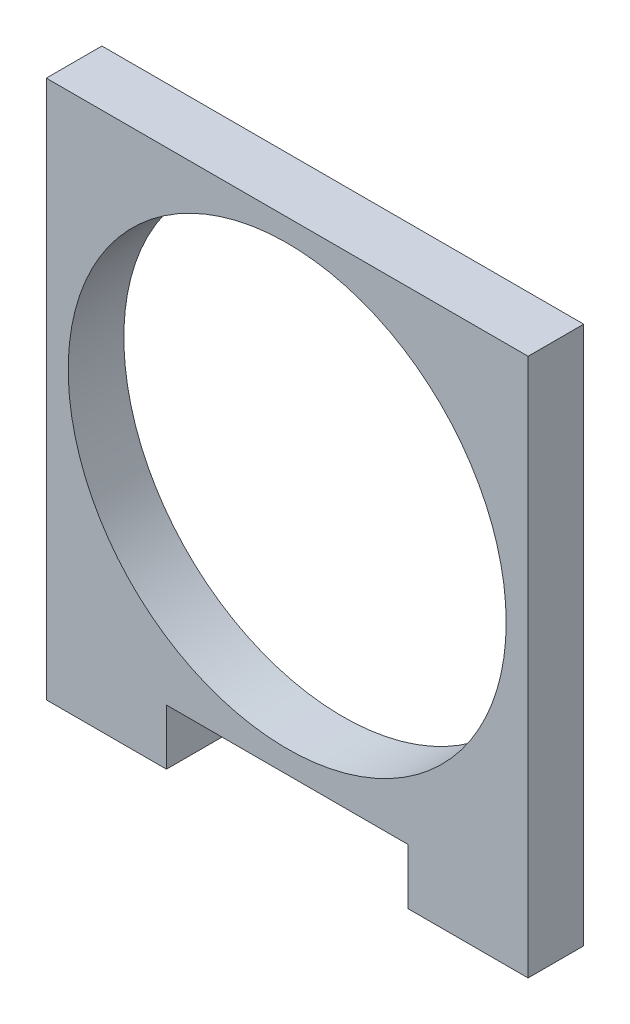
ISO-10303-21;
HEADER;
FILE_DESCRIPTION(('STEP AP214'),'2;1');
FILE_NAME('part.step','',(''),(''),'','','');
FILE_SCHEMA(('AUTOMOTIVE_DESIGN { 1 0 10303 214 1 1 1 1 }'));
ENDSEC;
DATA;
#1=APPLICATION_CONTEXT('core data for automotive mechanical design processes');
#2=APPLICATION_PROTOCOL_DEFINITION('international standard','automotive_design',2000,#1);
#3=PRODUCT_CONTEXT('',#1,'mechanical');
#4=PRODUCT('Part','Part','',(#3));
#5=PRODUCT_RELATED_PRODUCT_CATEGORY('part','',(#4));
#6=PRODUCT_DEFINITION_FORMATION('','',#4);
#7=PRODUCT_DEFINITION_CONTEXT('part definition',#1,'design');
#8=PRODUCT_DEFINITION('design','',#6,#7);
#9=PRODUCT_DEFINITION_SHAPE('','',#8);
#10=(LENGTH_UNIT() NAMED_UNIT(*) SI_UNIT(.MILLI.,.METRE.));
#11=(NAMED_UNIT(*) PLANE_ANGLE_UNIT() SI_UNIT($,.RADIAN.));
#12=(NAMED_UNIT(*) SI_UNIT($,.STERADIAN.) SOLID_ANGLE_UNIT());
#13=UNCERTAINTY_MEASURE_WITH_UNIT(LENGTH_MEASURE(1.E-05),#10,'distance_accuracy_value','');
#14=(GEOMETRIC_REPRESENTATION_CONTEXT(3) GLOBAL_UNCERTAINTY_ASSIGNED_CONTEXT((#13)) GLOBAL_UNIT_ASSIGNED_CONTEXT((#10,
#11,#12)) REPRESENTATION_CONTEXT('',''));
#15=CARTESIAN_POINT('',(0.,0.,0.));
#16=DIRECTION('',(0.,0.,1.));
#17=DIRECTION('',(1.,0.,0.));
#18=AXIS2_PLACEMENT_3D('',#15,#16,#17);
#19=CARTESIAN_POINT('',(0.,-6.35,6.35));
#20=DIRECTION('',(0.,1.,0.));
#21=DIRECTION('',(0.,0.,1.));
#22=AXIS2_PLACEMENT_3D('',#19,#20,#21);
#23=PLANE('',#22);
#24=DIRECTION('',(1.,0.,0.));
#25=VECTOR('',#24,1.);
#26=CARTESIAN_POINT('',(0.,-6.35,0.));
#27=LINE('',#26,#25);
#28=CARTESIAN_POINT('',(0.,-6.35,0.));
#29=VERTEX_POINT('',#28);
#30=CARTESIAN_POINT('',(13.716,-6.35,0.));
#31=VERTEX_POINT('',#30);
#32=EDGE_CURVE('E132',#29,#31,#27,.T.);
#33=ORIENTED_EDGE('',*,*,#32,.T.);
#34=DIRECTION('',(0.,0.,-1.));
#35=VECTOR('',#34,1.);
#36=CARTESIAN_POINT('',(13.716,-6.35,6.35));
#37=LINE('',#36,#35);
#38=CARTESIAN_POINT('',(13.716,-6.35,6.35));
#39=VERTEX_POINT('',#38);
#40=EDGE_CURVE('E40',#39,#31,#37,.T.);
#41=ORIENTED_EDGE('',*,*,#40,.F.);
#42=DIRECTION('',(1.,0.,0.));
#43=VECTOR('',#42,1.);
#44=CARTESIAN_POINT('',(0.,-6.35,6.35));
#45=LINE('',#44,#43);
#46=CARTESIAN_POINT('',(0.,-6.35,6.35));
#47=VERTEX_POINT('',#46);
#48=EDGE_CURVE('E91',#47,#39,#45,.T.);
#49=ORIENTED_EDGE('',*,*,#48,.F.);
#50=DIRECTION('',(0.,0.,-1.));
#51=VECTOR('',#50,1.);
#52=CARTESIAN_POINT('',(0.,-6.35,6.35));
#53=LINE('',#52,#51);
#54=EDGE_CURVE('E11',#47,#29,#53,.T.);
#55=ORIENTED_EDGE('',*,*,#54,.T.);
#56=EDGE_LOOP('',(#33,#41,#49,#55));
#57=FACE_BOUND('',#56,.T.);
#58=ADVANCED_FACE('F32',(#57),#23,.F.);
#59=CARTESIAN_POINT('',(13.716,0.,6.35));
#60=DIRECTION('',(-1.,0.,0.));
#61=DIRECTION('',(0.,-1.,0.));
#62=AXIS2_PLACEMENT_3D('',#59,#60,#61);
#63=PLANE('',#62);
#64=DIRECTION('',(0.,1.,0.));
#65=VECTOR('',#64,1.);
#66=CARTESIAN_POINT('',(13.716,0.,0.));
#67=LINE('',#66,#65);
#68=CARTESIAN_POINT('',(13.716,0.,0.));
#69=VERTEX_POINT('',#68);
#70=EDGE_CURVE('E134',#31,#69,#67,.T.);
#71=ORIENTED_EDGE('',*,*,#70,.T.);
#72=DIRECTION('',(0.,0.,-1.));
#73=VECTOR('',#72,1.);
#74=CARTESIAN_POINT('',(13.716,0.,6.35));
#75=LINE('',#74,#73);
#76=CARTESIAN_POINT('',(13.716,0.,6.35));
#77=VERTEX_POINT('',#76);
#78=EDGE_CURVE('E152',#77,#69,#75,.T.);
#79=ORIENTED_EDGE('',*,*,#78,.F.);
#80=DIRECTION('',(0.,1.,0.));
#81=VECTOR('',#80,1.);
#82=CARTESIAN_POINT('',(13.716,0.,6.35));
#83=LINE('',#82,#81);
#84=EDGE_CURVE('E160',#39,#77,#83,.T.);
#85=ORIENTED_EDGE('',*,*,#84,.F.);
#86=ORIENTED_EDGE('',*,*,#40,.T.);
#87=EDGE_LOOP('',(#71,#79,#85,#86));
#88=FACE_BOUND('',#87,.T.);
#89=ADVANCED_FACE('F158',(#88),#63,.F.);
#90=CARTESIAN_POINT('',(13.716,0.,6.35));
#91=DIRECTION('',(0.,1.,0.));
#92=DIRECTION('',(-1.,0.,0.));
#93=AXIS2_PLACEMENT_3D('',#90,#91,#92);
#94=PLANE('',#93);
#95=DIRECTION('',(1.,0.,0.));
#96=VECTOR('',#95,1.);
#97=CARTESIAN_POINT('',(13.716,0.,0.));
#98=LINE('',#97,#96);
#99=CARTESIAN_POINT('',(41.283999982,0.,0.));
#100=VERTEX_POINT('',#99);
#101=EDGE_CURVE('E137',#69,#100,#98,.T.);
#102=ORIENTED_EDGE('',*,*,#101,.T.);
#103=DIRECTION('',(0.,0.,-1.));
#104=VECTOR('',#103,1.);
#105=CARTESIAN_POINT('',(41.283999982,0.,6.35));
#106=LINE('',#105,#104);
#107=CARTESIAN_POINT('',(41.283999982,0.,6.35));
#108=VERTEX_POINT('',#107);
#109=EDGE_CURVE('E149',#108,#100,#106,.T.);
#110=ORIENTED_EDGE('',*,*,#109,.F.);
#111=DIRECTION('',(1.,0.,0.));
#112=VECTOR('',#111,1.);
#113=CARTESIAN_POINT('',(13.716,0.,6.35));
#114=LINE('',#113,#112);
#115=EDGE_CURVE('E173',#77,#108,#114,.T.);
#116=ORIENTED_EDGE('',*,*,#115,.F.);
#117=ORIENTED_EDGE('',*,*,#78,.T.);
#118=EDGE_LOOP('',(#102,#110,#116,#117));
#119=FACE_BOUND('',#118,.T.);
#120=ADVANCED_FACE('F169',(#119),#94,.F.);
#121=CARTESIAN_POINT('',(41.283999982,0.,6.35));
#122=DIRECTION('',(1.,0.,0.));
#123=DIRECTION('',(0.,0.,-1.));
#124=AXIS2_PLACEMENT_3D('',#121,#122,#123);
#125=PLANE('',#124);
#126=DIRECTION('',(0.,-1.,0.));
#127=VECTOR('',#126,1.);
#128=CARTESIAN_POINT('',(41.283999982,0.,0.));
#129=LINE('',#128,#127);
#130=CARTESIAN_POINT('',(41.283999982,-6.35,0.));
#131=VERTEX_POINT('',#130);
#132=EDGE_CURVE('E139',#100,#131,#129,.T.);
#133=ORIENTED_EDGE('',*,*,#132,.T.);
#134=DIRECTION('',(0.,0.,-1.));
#135=VECTOR('',#134,1.);
#136=CARTESIAN_POINT('',(41.283999982,-6.35,6.35));
#137=LINE('',#136,#135);
#138=CARTESIAN_POINT('',(41.283999982,-6.35,6.35));
#139=VERTEX_POINT('',#138);
#140=EDGE_CURVE('E121',#139,#131,#137,.T.);
#141=ORIENTED_EDGE('',*,*,#140,.F.);
#142=DIRECTION('',(0.,-1.,0.));
#143=VECTOR('',#142,1.);
#144=CARTESIAN_POINT('',(41.283999982,0.,6.35));
#145=LINE('',#144,#143);
#146=EDGE_CURVE('E111',#108,#139,#145,.T.);
#147=ORIENTED_EDGE('',*,*,#146,.F.);
#148=ORIENTED_EDGE('',*,*,#109,.T.);
#149=EDGE_LOOP('',(#133,#141,#147,#148));
#150=FACE_BOUND('',#149,.T.);
#151=ADVANCED_FACE('F172',(#150),#125,.F.);
#152=CARTESIAN_POINT('',(54.999999982,-6.34999999999999,6.35));
#153=DIRECTION('',(0.,1.,0.));
#154=DIRECTION('',(-1.,0.,0.));
#155=AXIS2_PLACEMENT_3D('',#152,#153,#154);
#156=PLANE('',#155);
#157=DIRECTION('',(1.,0.,0.));
#158=VECTOR('',#157,1.);
#159=CARTESIAN_POINT('',(54.999999982,-6.34999999999999,0.));
#160=LINE('',#159,#158);
#161=CARTESIAN_POINT('',(54.999999982,-6.34999999999999,0.));
#162=VERTEX_POINT('',#161);
#163=EDGE_CURVE('E120',#131,#162,#160,.T.);
#164=ORIENTED_EDGE('',*,*,#163,.T.);
#165=DIRECTION('',(0.,0.,-1.));
#166=VECTOR('',#165,1.);
#167=CARTESIAN_POINT('',(54.999999982,-6.34999999999999,6.35));
#168=LINE('',#167,#166);
#169=CARTESIAN_POINT('',(54.999999982,-6.34999999999999,6.35));
#170=VERTEX_POINT('',#169);
#171=EDGE_CURVE('E117',#170,#162,#168,.T.);
#172=ORIENTED_EDGE('',*,*,#171,.F.);
#173=DIRECTION('',(1.,0.,0.));
#174=VECTOR('',#173,1.);
#175=CARTESIAN_POINT('',(54.999999982,-6.34999999999999,6.35));
#176=LINE('',#175,#174);
#177=EDGE_CURVE('E105',#139,#170,#176,.T.);
#178=ORIENTED_EDGE('',*,*,#177,.F.);
#179=ORIENTED_EDGE('',*,*,#140,.T.);
#180=EDGE_LOOP('',(#164,#172,#178,#179));
#181=FACE_BOUND('',#180,.T.);
#182=ADVANCED_FACE('F118',(#181),#156,.F.);
#183=CARTESIAN_POINT('',(54.999999982,0.,6.35));
#184=DIRECTION('',(-1.,0.,0.));
#185=DIRECTION('',(0.,-1.,0.));
#186=AXIS2_PLACEMENT_3D('',#183,#184,#185);
#187=PLANE('',#186);
#188=DIRECTION('',(0.,1.,0.));
#189=VECTOR('',#188,1.);
#190=CARTESIAN_POINT('',(54.999999982,0.,0.));
#191=LINE('',#190,#189);
#192=CARTESIAN_POINT('',(54.999999982,55.118,0.));
#193=VERTEX_POINT('',#192);
#194=EDGE_CURVE('E77',#162,#193,#191,.T.);
#195=ORIENTED_EDGE('',*,*,#194,.T.);
#196=DIRECTION('',(0.,0.,-1.));
#197=VECTOR('',#196,1.);
#198=CARTESIAN_POINT('',(54.999999982,55.118,6.35));
#199=LINE('',#198,#197);
#200=CARTESIAN_POINT('',(54.999999982,55.118,6.35));
#201=VERTEX_POINT('',#200);
#202=EDGE_CURVE('E122',#201,#193,#199,.T.);
#203=ORIENTED_EDGE('',*,*,#202,.F.);
#204=DIRECTION('',(0.,1.,0.));
#205=VECTOR('',#204,1.);
#206=CARTESIAN_POINT('',(54.999999982,0.,6.35));
#207=LINE('',#206,#205);
#208=EDGE_CURVE('E109',#170,#201,#207,.T.);
#209=ORIENTED_EDGE('',*,*,#208,.F.);
#210=ORIENTED_EDGE('',*,*,#171,.T.);
#211=EDGE_LOOP('',(#195,#203,#209,#210));
#212=FACE_BOUND('',#211,.T.);
#213=ADVANCED_FACE('F124',(#212),#187,.F.);
#214=CARTESIAN_POINT('',(0.,55.118,6.35));
#215=DIRECTION('',(0.,-1.,0.));
#216=DIRECTION('',(1.,0.,0.));
#217=AXIS2_PLACEMENT_3D('',#214,#215,#216);
#218=PLANE('',#217);
#219=DIRECTION('',(-1.,0.,0.));
#220=VECTOR('',#219,1.);
#221=CARTESIAN_POINT('',(0.,55.118,0.));
#222=LINE('',#221,#220);
#223=CARTESIAN_POINT('',(0.,55.118,0.));
#224=VERTEX_POINT('',#223);
#225=EDGE_CURVE('E84',#193,#224,#222,.T.);
#226=ORIENTED_EDGE('',*,*,#225,.T.);
#227=DIRECTION('',(0.,0.,-1.));
#228=VECTOR('',#227,1.);
#229=CARTESIAN_POINT('',(0.,55.118,6.35));
#230=LINE('',#229,#228);
#231=CARTESIAN_POINT('',(0.,55.118,6.35));
#232=VERTEX_POINT('',#231);
#233=EDGE_CURVE('E128',#232,#224,#230,.T.);
#234=ORIENTED_EDGE('',*,*,#233,.F.);
#235=DIRECTION('',(-1.,0.,0.));
#236=VECTOR('',#235,1.);
#237=CARTESIAN_POINT('',(0.,55.118,6.35));
#238=LINE('',#237,#236);
#239=EDGE_CURVE('E126',#201,#232,#238,.T.);
#240=ORIENTED_EDGE('',*,*,#239,.F.);
#241=ORIENTED_EDGE('',*,*,#202,.T.);
#242=EDGE_LOOP('',(#226,#234,#240,#241));
#243=FACE_BOUND('',#242,.T.);
#244=ADVANCED_FACE('F200',(#243),#218,.F.);
#245=CARTESIAN_POINT('',(0.,0.,6.35));
#246=DIRECTION('',(1.,0.,0.));
#247=DIRECTION('',(0.,0.,-1.));
#248=AXIS2_PLACEMENT_3D('',#245,#246,#247);
#249=PLANE('',#248);
#250=DIRECTION('',(0.,-1.,0.));
#251=VECTOR('',#250,1.);
#252=CARTESIAN_POINT('',(0.,0.,0.));
#253=LINE('',#252,#251);
#254=EDGE_CURVE('E144',#224,#29,#253,.T.);
#255=ORIENTED_EDGE('',*,*,#254,.T.);
#256=ORIENTED_EDGE('',*,*,#54,.F.);
#257=DIRECTION('',(0.,-1.,0.));
#258=VECTOR('',#257,1.);
#259=CARTESIAN_POINT('',(0.,0.,6.35));
#260=LINE('',#259,#258);
#261=EDGE_CURVE('E48',#232,#47,#260,.T.);
#262=ORIENTED_EDGE('',*,*,#261,.F.);
#263=ORIENTED_EDGE('',*,*,#233,.T.);
#264=EDGE_LOOP('',(#255,#256,#262,#263));
#265=FACE_BOUND('',#264,.T.);
#266=ADVANCED_FACE('F199',(#265),#249,.F.);
#267=CARTESIAN_POINT('',(0.,0.,6.35));
#268=DIRECTION('',(0.,0.,1.));
#269=DIRECTION('',(1.,0.,0.));
#270=AXIS2_PLACEMENT_3D('',#267,#268,#269);
#271=PLANE('',#270);
#272=CARTESIAN_POINT('',(27.499999991,27.559,6.35));
#273=DIRECTION('',(0.,0.,1.));
#274=DIRECTION('',(1.,0.,0.));
#275=AXIS2_PLACEMENT_3D('',#272,#273,#274);
#276=CIRCLE('',#275,25.000000038);
#277=CARTESIAN_POINT('',(52.500000029,27.559,6.35));
#278=VERTEX_POINT('',#277);
#279=EDGE_CURVE('E135',#278,#278,#276,.T.);
#280=ORIENTED_EDGE('',*,*,#279,.F.);
#281=EDGE_LOOP('',(#280));
#282=FACE_BOUND('',#281,.T.);
#283=ORIENTED_EDGE('',*,*,#261,.T.);
#284=ORIENTED_EDGE('',*,*,#48,.T.);
#285=ORIENTED_EDGE('',*,*,#84,.T.);
#286=ORIENTED_EDGE('',*,*,#115,.T.);
#287=ORIENTED_EDGE('',*,*,#146,.T.);
#288=ORIENTED_EDGE('',*,*,#177,.T.);
#289=ORIENTED_EDGE('',*,*,#208,.T.);
#290=ORIENTED_EDGE('',*,*,#239,.T.);
#291=EDGE_LOOP('',(#283,#284,#285,#286,#287,#288,#289,#290));
#292=FACE_BOUND('',#291,.T.);
#293=ADVANCED_FACE('F107',(#282,#292),#271,.T.);
#294=CARTESIAN_POINT('',(0.,0.,0.));
#295=DIRECTION('',(0.,0.,1.));
#296=DIRECTION('',(1.,0.,0.));
#297=AXIS2_PLACEMENT_3D('',#294,#295,#296);
#298=PLANE('',#297);
#299=CARTESIAN_POINT('',(27.499999991,27.559,0.));
#300=DIRECTION('',(0.,0.,1.));
#301=DIRECTION('',(1.,0.,0.));
#302=AXIS2_PLACEMENT_3D('',#299,#300,#301);
#303=CIRCLE('',#302,25.000000038);
#304=CARTESIAN_POINT('',(52.500000029,27.559,0.));
#305=VERTEX_POINT('',#304);
#306=EDGE_CURVE('E181',#305,#305,#303,.T.);
#307=ORIENTED_EDGE('',*,*,#306,.T.);
#308=EDGE_LOOP('',(#307));
#309=FACE_BOUND('',#308,.T.);
#310=ORIENTED_EDGE('',*,*,#32,.F.);
#311=ORIENTED_EDGE('',*,*,#254,.F.);
#312=ORIENTED_EDGE('',*,*,#225,.F.);
#313=ORIENTED_EDGE('',*,*,#194,.F.);
#314=ORIENTED_EDGE('',*,*,#163,.F.);
#315=ORIENTED_EDGE('',*,*,#132,.F.);
#316=ORIENTED_EDGE('',*,*,#101,.F.);
#317=ORIENTED_EDGE('',*,*,#70,.F.);
#318=EDGE_LOOP('',(#310,#311,#312,#313,#314,#315,#316,#317));
#319=FACE_BOUND('',#318,.T.);
#320=ADVANCED_FACE('F164',(#309,#319),#298,.F.);
#321=CARTESIAN_POINT('',(27.499999991,27.559,0.));
#322=DIRECTION('',(0.,0.,1.));
#323=DIRECTION('',(1.,0.,0.));
#324=AXIS2_PLACEMENT_3D('',#321,#322,#323);
#325=CYLINDRICAL_SURFACE('',#324,25.000000038);
#326=ORIENTED_EDGE('',*,*,#279,.T.);
#327=EDGE_LOOP('',(#326));
#328=FACE_BOUND('',#327,.T.);
#329=ORIENTED_EDGE('',*,*,#306,.F.);
#330=EDGE_LOOP('',(#329));
#331=FACE_BOUND('',#330,.T.);
#332=ADVANCED_FACE('F186',(#328,#331),#325,.F.);
#333=CLOSED_SHELL('',(#58,#89,#120,#151,#182,#213,#244,#266,#293,#320,#332));
#334=MANIFOLD_SOLID_BREP('B2',#333);
#335=ADVANCED_BREP_SHAPE_REPRESENTATION('',(#18,#334),#14);
#336=SHAPE_DEFINITION_REPRESENTATION(#9,#335);
ENDSEC;
END-ISO-10303-21;
